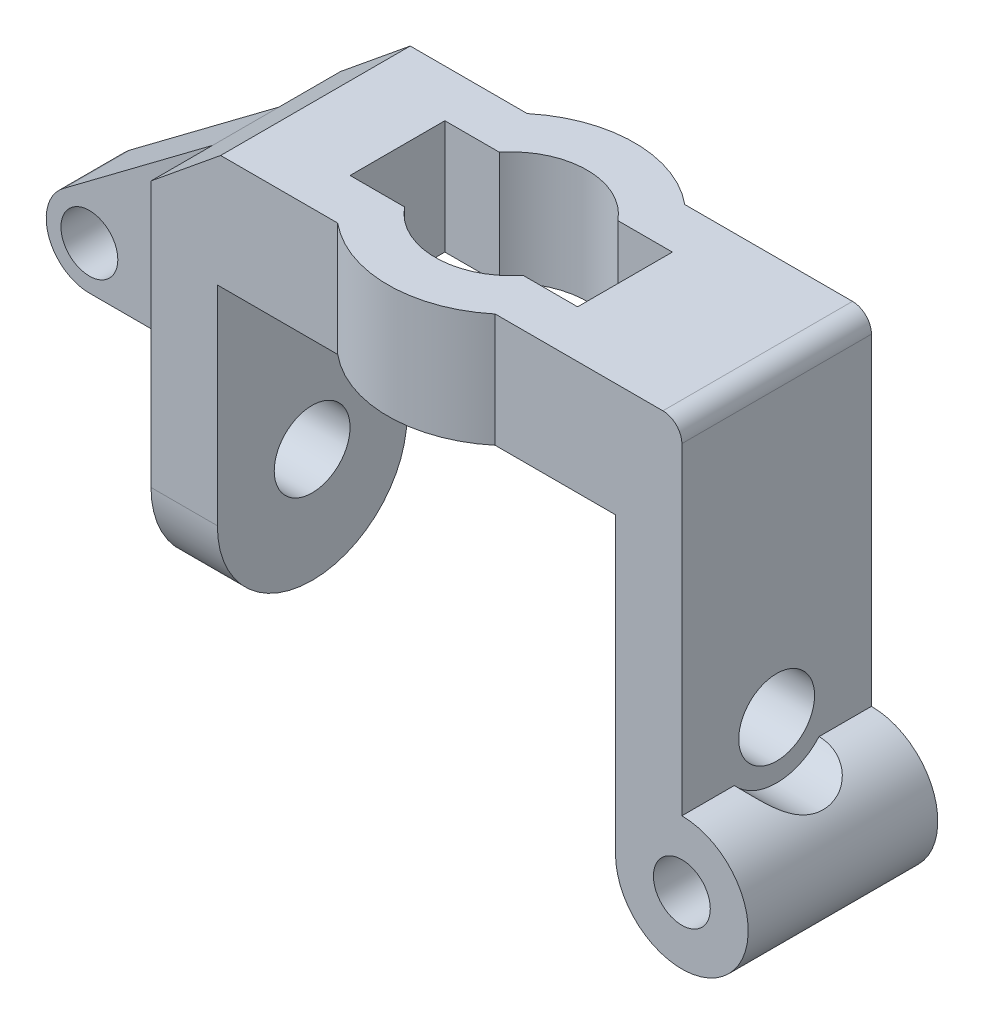
ISO-10303-21;
HEADER;
FILE_DESCRIPTION(('STEP AP214'),'2;1');
FILE_NAME('part.step','',(''),(''),'','','');
FILE_SCHEMA(('AUTOMOTIVE_DESIGN { 1 0 10303 214 1 1 1 1 }'));
ENDSEC;
DATA;
#1=APPLICATION_CONTEXT('core data for automotive mechanical design processes');
#2=APPLICATION_PROTOCOL_DEFINITION('international standard','automotive_design',2000,#1);
#3=PRODUCT_CONTEXT('',#1,'mechanical');
#4=PRODUCT('Part','Part','',(#3));
#5=PRODUCT_RELATED_PRODUCT_CATEGORY('part','',(#4));
#6=PRODUCT_DEFINITION_FORMATION('','',#4);
#7=PRODUCT_DEFINITION_CONTEXT('part definition',#1,'design');
#8=PRODUCT_DEFINITION('design','',#6,#7);
#9=PRODUCT_DEFINITION_SHAPE('','',#8);
#10=(LENGTH_UNIT() NAMED_UNIT(*) SI_UNIT(.MILLI.,.METRE.));
#11=(NAMED_UNIT(*) PLANE_ANGLE_UNIT() SI_UNIT($,.RADIAN.));
#12=(NAMED_UNIT(*) SI_UNIT($,.STERADIAN.) SOLID_ANGLE_UNIT());
#13=UNCERTAINTY_MEASURE_WITH_UNIT(LENGTH_MEASURE(1.E-05),#10,'distance_accuracy_value','');
#14=(GEOMETRIC_REPRESENTATION_CONTEXT(3) GLOBAL_UNCERTAINTY_ASSIGNED_CONTEXT((#13)) GLOBAL_UNIT_ASSIGNED_CONTEXT((#10,
#11,#12)) REPRESENTATION_CONTEXT('',''));
#15=CARTESIAN_POINT('',(0.,0.,0.));
#16=DIRECTION('',(0.,0.,1.));
#17=DIRECTION('',(1.,0.,0.));
#18=AXIS2_PLACEMENT_3D('',#15,#16,#17);
#19=CARTESIAN_POINT('',(28.,0.499999999999997,10.));
#20=DIRECTION('',(0.,0.,-1.));
#21=DIRECTION('',(-1.,0.,0.));
#22=AXIS2_PLACEMENT_3D('',#19,#20,#21);
#23=CYLINDRICAL_SURFACE('',#22,3.5);
#24=CARTESIAN_POINT('',(28.,4.,7.23606797749979));
#25=CARTESIAN_POINT('',(28.0694603582354,4.00001059895191,7.23605558571707));
#26=CARTESIAN_POINT('',(28.1389208504431,3.99793234925885,7.23421800253059));
#27=CARTESIAN_POINT('',(28.2774124358075,3.98967572407927,7.22680329751896));
#28=CARTESIAN_POINT('',(28.3464434284025,3.98349642234035,7.22122533089808));
#29=CARTESIAN_POINT('',(28.4838536248723,3.96708678096784,7.20621451288525));
#30=CARTESIAN_POINT('',(28.5522297181049,3.95684239582203,7.1967682924004));
#31=CARTESIAN_POINT('',(28.6875830116378,3.9324873534187,7.17385981922841));
#32=CARTESIAN_POINT('',(28.7545603023102,3.91837694676905,7.16039782685141));
#33=CARTESIAN_POINT('',(28.9529737469261,3.87050289271094,7.11359499674465));
#34=CARTESIAN_POINT('',(29.0817033689652,3.83121964375717,7.07385642379149));
#35=CARTESIAN_POINT('',(29.3271488358344,3.74125561895766,6.97546757579804));
#36=CARTESIAN_POINT('',(29.4438865911102,3.69059618859735,6.91685263081298));
#37=CARTESIAN_POINT('',(29.6559706263511,3.58562246719081,6.78259490356209));
#38=CARTESIAN_POINT('',(29.7520922612167,3.53161544609046,6.70794447741663));
#39=CARTESIAN_POINT('',(29.9268196044409,3.42368534089598,6.540287332873));
#40=CARTESIAN_POINT('',(30.0054321396643,3.36976223225628,6.44728779563025));
#41=CARTESIAN_POINT('',(30.1363601938254,3.27343049226639,6.25544210120086));
#42=CARTESIAN_POINT('',(30.1905453410244,3.23040815182112,6.15817256087937));
#43=CARTESIAN_POINT('',(30.2832870663822,3.15334737662745,5.95317725286729));
#44=CARTESIAN_POINT('',(30.3218437974595,3.11930885397679,5.84545158749888));
#45=CARTESIAN_POINT('',(30.3828128767488,3.06395330011002,5.62613663266108));
#46=CARTESIAN_POINT('',(30.4056736760428,3.04228616944936,5.51475932542443));
#47=CARTESIAN_POINT('',(30.4375887179098,3.01170328330837,5.28833380285907));
#48=CARTESIAN_POINT('',(30.4466417763198,3.00278862149416,5.17328527354709));
#49=CARTESIAN_POINT('',(30.4512327772078,2.99829375860991,4.94069364656642));
#50=CARTESIAN_POINT('',(30.4465379800806,3.00294318109827,4.82314142789273));
#51=CARTESIAN_POINT('',(30.4229859447946,3.02574817414428,4.59079281696566));
#52=CARTESIAN_POINT('',(30.4041287806935,3.04390367407604,4.47599641030486));
#53=CARTESIAN_POINT('',(30.3516898791931,3.09245581832344,4.252107331064));
#54=CARTESIAN_POINT('',(30.3180625506188,3.12289034050714,4.14303349869407));
#55=CARTESIAN_POINT('',(30.2355824126994,3.19352927796428,3.93423041742039));
#56=CARTESIAN_POINT('',(30.1867342454853,3.2337307136508,3.83449833146729));
#57=CARTESIAN_POINT('',(30.0747680161379,3.31961070113789,3.6487750110606));
#58=CARTESIAN_POINT('',(30.0119151963145,3.36518085069905,3.56257349598757));
#59=CARTESIAN_POINT('',(29.8722612752454,3.45832094281018,3.4036390498356));
#60=CARTESIAN_POINT('',(29.7954606149475,3.50589082210405,3.33090569312031));
#61=CARTESIAN_POINT('',(29.6287663129003,3.59940774084438,3.19895038550356));
#62=CARTESIAN_POINT('',(29.5387543417587,3.64533487922335,3.13986448125606));
#63=CARTESIAN_POINT('',(29.3484721661188,3.73149216102068,3.03570460676564));
#64=CARTESIAN_POINT('',(29.2481963564248,3.77171916263215,2.99063834765253));
#65=CARTESIAN_POINT('',(29.0316117260637,3.84663053067774,2.91043976431284));
#66=CARTESIAN_POINT('',(28.9146620297905,3.88061394293885,2.87639070852977));
#67=CARTESIAN_POINT('',(28.6748659625385,3.9365262763189,2.82201841424072));
#68=CARTESIAN_POINT('',(28.5520202434816,3.95845652682975,2.8016936619693));
#69=CARTESIAN_POINT('',(28.3570005657327,3.98247739403819,2.77970027691788));
#70=CARTESIAN_POINT('',(28.2857986142825,3.98904496461422,2.77376657646234));
#71=CARTESIAN_POINT('',(28.1430713766045,3.9978048634934,2.76589422192441));
#72=CARTESIAN_POINT('',(28.0715472173253,4.00000726425708,2.76394637031206));
#73=CARTESIAN_POINT('',(28.,4.,2.7639320225002));
#74=B_SPLINE_CURVE_WITH_KNOTS('',3,(#24,#25,#26,#27,#28,#29,#30,#31,#32,#33,#34,#35,#36,#37,#38,
#39,#40,#41,#42,#43,#44,#45,#46,#47,#48,#49,#50,#51,#52,#53,#54,#55,#56,#57,#58,#59,#60,#61,#62,
#63,#64,#65,#66,#67,#68,#69,#70,#71,#72,#73),.UNSPECIFIED.,.F.,.F.,(4,2,2,2,2,2,2,2,2,2,2,2,2,2,
2,2,2,2,2,2,2,2,2,2,4),(0.,0.208325126645252,0.416697321053937,0.62579583262883,
0.834880792976182,1.2536151766188,1.67157034500051,2.06872958242957,2.46573369380905,
2.822040709628,3.17834423902776,3.52398903677499,3.86966347563302,4.22122353999218,
4.57278176598822,4.92543286009944,5.27797650592966,5.62433829777031,5.97068914161548,
6.32035645057338,6.6702157459979,7.04806642956408,7.42587543008453,7.64090629382609,
7.85544040182195),.UNSPECIFIED.);
#75=CARTESIAN_POINT('',(28.,4.,7.23606797749979));
#76=VERTEX_POINT('',#75);
#77=CARTESIAN_POINT('',(28.,4.,2.7639320225002));
#78=VERTEX_POINT('',#77);
#79=EDGE_CURVE('E225',#76,#78,#74,.T.);
#80=ORIENTED_EDGE('',*,*,#79,.F.);
#81=DIRECTION('',(0.,0.,-1.));
#82=VECTOR('',#81,1.);
#83=CARTESIAN_POINT('',(28.,4.,10.));
#84=LINE('',#83,#82);
#85=CARTESIAN_POINT('',(28.,4.,10.));
#86=VERTEX_POINT('',#85);
#87=EDGE_CURVE('E234',#86,#76,#84,.T.);
#88=ORIENTED_EDGE('',*,*,#87,.F.);
#89=CARTESIAN_POINT('',(28.,0.499999999999997,10.));
#90=DIRECTION('',(0.,0.,1.));
#91=DIRECTION('',(1.,0.,0.));
#92=AXIS2_PLACEMENT_3D('',#89,#90,#91);
#93=CIRCLE('',#92,3.5);
#94=CARTESIAN_POINT('',(24.5,0.499999999999997,10.));
#95=VERTEX_POINT('',#94);
#96=EDGE_CURVE('E436',#95,#86,#93,.T.);
#97=ORIENTED_EDGE('',*,*,#96,.F.);
#98=DIRECTION('',(0.,0.,-1.));
#99=VECTOR('',#98,1.);
#100=CARTESIAN_POINT('',(24.5,0.499999999999997,10.));
#101=LINE('',#100,#99);
#102=CARTESIAN_POINT('',(24.5,0.499999999999997,0.));
#103=VERTEX_POINT('',#102);
#104=EDGE_CURVE('E244',#95,#103,#101,.T.);
#105=ORIENTED_EDGE('',*,*,#104,.T.);
#106=CARTESIAN_POINT('',(28.,0.499999999999997,0.));
#107=DIRECTION('',(0.,0.,1.));
#108=DIRECTION('',(1.,0.,0.));
#109=AXIS2_PLACEMENT_3D('',#106,#107,#108);
#110=CIRCLE('',#109,3.5);
#111=CARTESIAN_POINT('',(28.,4.,0.));
#112=VERTEX_POINT('',#111);
#113=EDGE_CURVE('E450',#103,#112,#110,.T.);
#114=ORIENTED_EDGE('',*,*,#113,.T.);
#115=EDGE_CURVE('E236',#78,#112,#84,.T.);
#116=ORIENTED_EDGE('',*,*,#115,.F.);
#117=EDGE_LOOP('',(#80,#88,#97,#105,#114,#116));
#118=FACE_BOUND('',#117,.T.);
#119=ADVANCED_FACE('F40',(#118),#23,.T.);
#120=CARTESIAN_POINT('',(0.,0.,10.));
#121=DIRECTION('',(-1.,0.,0.));
#122=DIRECTION('',(0.,0.,1.));
#123=AXIS2_PLACEMENT_3D('',#120,#121,#122);
#124=PLANE('',#123);
#125=CARTESIAN_POINT('',(0.,6.,5.));
#126=DIRECTION('',(1.,0.,0.));
#127=DIRECTION('',(0.,0.,-1.));
#128=AXIS2_PLACEMENT_3D('',#125,#126,#127);
#129=CIRCLE('',#128,2.);
#130=CARTESIAN_POINT('',(0.,6.,3.));
#131=VERTEX_POINT('',#130);
#132=EDGE_CURVE('E237',#131,#131,#129,.T.);
#133=ORIENTED_EDGE('',*,*,#132,.T.);
#134=EDGE_LOOP('',(#133));
#135=FACE_BOUND('',#134,.T.);
#136=DIRECTION('',(0.,1.,0.));
#137=VECTOR('',#136,1.);
#138=CARTESIAN_POINT('',(0.,0.,0.));
#139=LINE('',#138,#137);
#140=CARTESIAN_POINT('',(0.,5.,0.));
#141=VERTEX_POINT('',#140);
#142=CARTESIAN_POINT('',(0.,19.,0.));
#143=VERTEX_POINT('',#142);
#144=EDGE_CURVE('E251',#141,#143,#139,.T.);
#145=ORIENTED_EDGE('',*,*,#144,.F.);
#146=CARTESIAN_POINT('',(0.,5.,5.));
#147=DIRECTION('',(-1.,0.,0.));
#148=DIRECTION('',(0.,0.,1.));
#149=AXIS2_PLACEMENT_3D('',#146,#147,#148);
#150=CIRCLE('',#149,5.);
#151=CARTESIAN_POINT('',(0.,0.,5.));
#152=VERTEX_POINT('',#151);
#153=EDGE_CURVE('E49',#141,#152,#150,.T.);
#154=ORIENTED_EDGE('',*,*,#153,.T.);
#155=CARTESIAN_POINT('',(0.,5.,5.));
#156=DIRECTION('',(-1.,0.,0.));
#157=DIRECTION('',(0.,0.,1.));
#158=AXIS2_PLACEMENT_3D('',#155,#156,#157);
#159=CIRCLE('',#158,5.);
#160=CARTESIAN_POINT('',(0.,5.,10.));
#161=VERTEX_POINT('',#160);
#162=EDGE_CURVE('E60',#152,#161,#159,.T.);
#163=ORIENTED_EDGE('',*,*,#162,.T.);
#164=DIRECTION('',(0.,1.,0.));
#165=VECTOR('',#164,1.);
#166=CARTESIAN_POINT('',(0.,0.,10.));
#167=LINE('',#166,#165);
#168=CARTESIAN_POINT('',(0.,19.,10.));
#169=VERTEX_POINT('',#168);
#170=EDGE_CURVE('E249',#161,#169,#167,.T.);
#171=ORIENTED_EDGE('',*,*,#170,.T.);
#172=DIRECTION('',(0.,0.,1.));
#173=VECTOR('',#172,1.);
#174=CARTESIAN_POINT('',(0.,19.,-1.5));
#175=LINE('',#174,#173);
#176=CARTESIAN_POINT('',(0.,19.,6.75));
#177=VERTEX_POINT('',#176);
#178=EDGE_CURVE('E310',#177,#169,#175,.T.);
#179=ORIENTED_EDGE('',*,*,#178,.F.);
#180=DIRECTION('',(0.,-1.,0.));
#181=VECTOR('',#180,1.);
#182=CARTESIAN_POINT('',(0.,0.,6.75));
#183=LINE('',#182,#181);
#184=CARTESIAN_POINT('',(0.,9.,6.75));
#185=VERTEX_POINT('',#184);
#186=EDGE_CURVE('E331',#177,#185,#183,.T.);
#187=ORIENTED_EDGE('',*,*,#186,.T.);
#188=DIRECTION('',(0.,0.,1.));
#189=VECTOR('',#188,1.);
#190=CARTESIAN_POINT('',(0.,9.,3.25));
#191=LINE('',#190,#189);
#192=CARTESIAN_POINT('',(0.,9.,3.25));
#193=VERTEX_POINT('',#192);
#194=EDGE_CURVE('E348',#193,#185,#191,.T.);
#195=ORIENTED_EDGE('',*,*,#194,.F.);
#196=DIRECTION('',(0.,-1.,0.));
#197=VECTOR('',#196,1.);
#198=CARTESIAN_POINT('',(0.,0.,3.25));
#199=LINE('',#198,#197);
#200=CARTESIAN_POINT('',(0.,19.,3.25));
#201=VERTEX_POINT('',#200);
#202=EDGE_CURVE('E342',#201,#193,#199,.T.);
#203=ORIENTED_EDGE('',*,*,#202,.F.);
#204=EDGE_CURVE('E313',#143,#201,#175,.T.);
#205=ORIENTED_EDGE('',*,*,#204,.F.);
#206=EDGE_LOOP('',(#145,#154,#163,#171,#179,#187,#195,#203,#205));
#207=FACE_BOUND('',#206,.T.);
#208=ADVANCED_FACE('F508',(#135,#207),#124,.T.);
#209=CARTESIAN_POINT('',(0.,22.,10.));
#210=DIRECTION('',(0.,1.,0.));
#211=DIRECTION('',(0.,0.,1.));
#212=AXIS2_PLACEMENT_3D('',#209,#210,#211);
#213=PLANE('',#212);
#214=DIRECTION('',(1.,0.,0.));
#215=VECTOR('',#214,1.);
#216=CARTESIAN_POINT('',(0.,22.,7.5));
#217=LINE('',#216,#215);
#218=CARTESIAN_POINT('',(8.,22.,7.5));
#219=VERTEX_POINT('',#218);
#220=CARTESIAN_POINT('',(10.8775010008008,22.,7.5));
#221=VERTEX_POINT('',#220);
#222=EDGE_CURVE('E268',#219,#221,#217,.T.);
#223=ORIENTED_EDGE('',*,*,#222,.F.);
#224=DIRECTION('',(0.,0.,1.));
#225=VECTOR('',#224,1.);
#226=CARTESIAN_POINT('',(8.,22.,0.));
#227=LINE('',#226,#225);
#228=CARTESIAN_POINT('',(8.,22.,2.5));
#229=VERTEX_POINT('',#228);
#230=EDGE_CURVE('E360',#229,#219,#227,.T.);
#231=ORIENTED_EDGE('',*,*,#230,.F.);
#232=DIRECTION('',(1.,0.,0.));
#233=VECTOR('',#232,1.);
#234=CARTESIAN_POINT('',(0.,22.,2.5));
#235=LINE('',#234,#233);
#236=CARTESIAN_POINT('',(10.8775010008008,22.,2.5));
#237=VERTEX_POINT('',#236);
#238=EDGE_CURVE('E395',#229,#237,#235,.T.);
#239=ORIENTED_EDGE('',*,*,#238,.T.);
#240=CARTESIAN_POINT('',(14.,22.,5.));
#241=DIRECTION('',(0.,1.,0.));
#242=DIRECTION('',(0.,0.,1.));
#243=AXIS2_PLACEMENT_3D('',#240,#241,#242);
#244=CIRCLE('',#243,4.);
#245=CARTESIAN_POINT('',(17.1224989991992,22.,2.5));
#246=VERTEX_POINT('',#245);
#247=EDGE_CURVE('E392',#246,#237,#244,.T.);
#248=ORIENTED_EDGE('',*,*,#247,.F.);
#249=DIRECTION('',(1.,0.,0.));
#250=VECTOR('',#249,1.);
#251=CARTESIAN_POINT('',(0.,22.,2.5));
#252=LINE('',#251,#250);
#253=CARTESIAN_POINT('',(20.,22.,2.5));
#254=VERTEX_POINT('',#253);
#255=EDGE_CURVE('E389',#246,#254,#252,.T.);
#256=ORIENTED_EDGE('',*,*,#255,.T.);
#257=DIRECTION('',(0.,0.,1.));
#258=VECTOR('',#257,1.);
#259=CARTESIAN_POINT('',(20.,22.,0.));
#260=LINE('',#259,#258);
#261=CARTESIAN_POINT('',(20.,22.,7.5));
#262=VERTEX_POINT('',#261);
#263=EDGE_CURVE('E386',#254,#262,#260,.T.);
#264=ORIENTED_EDGE('',*,*,#263,.T.);
#265=DIRECTION('',(1.,0.,0.));
#266=VECTOR('',#265,1.);
#267=CARTESIAN_POINT('',(0.,22.,7.5));
#268=LINE('',#267,#266);
#269=CARTESIAN_POINT('',(17.1224989991992,22.,7.5));
#270=VERTEX_POINT('',#269);
#271=EDGE_CURVE('E383',#270,#262,#268,.T.);
#272=ORIENTED_EDGE('',*,*,#271,.F.);
#273=CARTESIAN_POINT('',(14.,22.,5.));
#274=DIRECTION('',(0.,1.,0.));
#275=DIRECTION('',(0.,0.,1.));
#276=AXIS2_PLACEMENT_3D('',#273,#274,#275);
#277=CIRCLE('',#276,4.);
#278=EDGE_CURVE('E380',#221,#270,#277,.T.);
#279=ORIENTED_EDGE('',*,*,#278,.F.);
#280=EDGE_LOOP('',(#223,#231,#239,#248,#256,#264,#272,#279));
#281=FACE_BOUND('',#280,.T.);
#282=DIRECTION('',(1.,0.,0.));
#283=VECTOR('',#282,1.);
#284=CARTESIAN_POINT('',(0.,22.,10.));
#285=LINE('',#284,#283);
#286=CARTESIAN_POINT('',(18.153311931459,22.,10.));
#287=VERTEX_POINT('',#286);
#288=CARTESIAN_POINT('',(27.,22.,10.));
#289=VERTEX_POINT('',#288);
#290=EDGE_CURVE('E439',#287,#289,#285,.T.);
#291=ORIENTED_EDGE('',*,*,#290,.T.);
#292=DIRECTION('',(0.,0.,-1.));
#293=VECTOR('',#292,1.);
#294=CARTESIAN_POINT('',(27.,22.,10.));
#295=LINE('',#294,#293);
#296=CARTESIAN_POINT('',(27.,22.,0.));
#297=VERTEX_POINT('',#296);
#298=EDGE_CURVE('E264',#289,#297,#295,.T.);
#299=ORIENTED_EDGE('',*,*,#298,.T.);
#300=DIRECTION('',(1.,0.,0.));
#301=VECTOR('',#300,1.);
#302=CARTESIAN_POINT('',(0.,22.,0.));
#303=LINE('',#302,#301);
#304=CARTESIAN_POINT('',(18.153311931459,22.,0.));
#305=VERTEX_POINT('',#304);
#306=EDGE_CURVE('E454',#305,#297,#303,.T.);
#307=ORIENTED_EDGE('',*,*,#306,.F.);
#308=CARTESIAN_POINT('',(14.,22.,5.));
#309=DIRECTION('',(0.,1.,0.));
#310=DIRECTION('',(0.,0.,1.));
#311=AXIS2_PLACEMENT_3D('',#308,#309,#310);
#312=CIRCLE('',#311,6.5);
#313=CARTESIAN_POINT('',(9.84668806854096,22.,0.));
#314=VERTEX_POINT('',#313);
#315=EDGE_CURVE('E420',#305,#314,#312,.T.);
#316=ORIENTED_EDGE('',*,*,#315,.T.);
#317=CARTESIAN_POINT('',(3.67295557835446,22.,0.));
#318=VERTEX_POINT('',#317);
#319=EDGE_CURVE('E455',#318,#314,#303,.T.);
#320=ORIENTED_EDGE('',*,*,#319,.F.);
#321=DIRECTION('',(0.,0.,1.));
#322=VECTOR('',#321,1.);
#323=CARTESIAN_POINT('',(3.67295557835446,22.,-1.5));
#324=LINE('',#323,#322);
#325=CARTESIAN_POINT('',(3.67295557835446,22.,10.));
#326=VERTEX_POINT('',#325);
#327=EDGE_CURVE('E289',#318,#326,#324,.T.);
#328=ORIENTED_EDGE('',*,*,#327,.T.);
#329=CARTESIAN_POINT('',(9.84668806854096,22.,10.));
#330=VERTEX_POINT('',#329);
#331=EDGE_CURVE('E440',#326,#330,#285,.T.);
#332=ORIENTED_EDGE('',*,*,#331,.T.);
#333=EDGE_CURVE('E402',#330,#287,#312,.T.);
#334=ORIENTED_EDGE('',*,*,#333,.T.);
#335=EDGE_LOOP('',(#291,#299,#307,#316,#320,#328,#332,#334));
#336=FACE_BOUND('',#335,.T.);
#337=ADVANCED_FACE('F469',(#281,#336),#213,.T.);
#338=CARTESIAN_POINT('',(0.,0.,10.));
#339=DIRECTION('',(0.,0.,1.));
#340=DIRECTION('',(1.,0.,0.));
#341=AXIS2_PLACEMENT_3D('',#338,#339,#340);
#342=PLANE('',#341);
#343=ORIENTED_EDGE('',*,*,#170,.F.);
#344=DIRECTION('',(1.,0.,0.));
#345=VECTOR('',#344,1.);
#346=CARTESIAN_POINT('',(3.5,5.,10.));
#347=LINE('',#346,#345);
#348=CARTESIAN_POINT('',(3.5,5.,10.));
#349=VERTEX_POINT('',#348);
#350=EDGE_CURVE('E11',#161,#349,#347,.T.);
#351=ORIENTED_EDGE('',*,*,#350,.T.);
#352=DIRECTION('',(0.,1.,0.));
#353=VECTOR('',#352,1.);
#354=CARTESIAN_POINT('',(3.5,0.,10.));
#355=LINE('',#354,#353);
#356=CARTESIAN_POINT('',(3.5,16.,10.));
#357=VERTEX_POINT('',#356);
#358=EDGE_CURVE('E428',#349,#357,#355,.T.);
#359=ORIENTED_EDGE('',*,*,#358,.T.);
#360=DIRECTION('',(1.,0.,0.));
#361=VECTOR('',#360,1.);
#362=CARTESIAN_POINT('',(0.,16.,10.));
#363=LINE('',#362,#361);
#364=CARTESIAN_POINT('',(9.84668806854096,16.,10.));
#365=VERTEX_POINT('',#364);
#366=EDGE_CURVE('E431',#357,#365,#363,.T.);
#367=ORIENTED_EDGE('',*,*,#366,.T.);
#368=DIRECTION('',(0.,1.,0.));
#369=VECTOR('',#368,1.);
#370=CARTESIAN_POINT('',(9.84668806854096,16.,10.));
#371=LINE('',#370,#369);
#372=EDGE_CURVE('E422',#330,#365,#371,.F.);
#373=ORIENTED_EDGE('',*,*,#372,.F.);
#374=ORIENTED_EDGE('',*,*,#331,.F.);
#375=DIRECTION('',(-0.774488777671264,-0.632587648679036,0.));
#376=VECTOR('',#375,1.);
#377=CARTESIAN_POINT('',(-9.30870866111195,11.3968244680358,10.));
#378=LINE('',#377,#376);
#379=EDGE_CURVE('E319',#326,#169,#378,.T.);
#380=ORIENTED_EDGE('',*,*,#379,.T.);
#381=EDGE_LOOP('',(#343,#351,#359,#367,#373,#374,#380));
#382=FACE_BOUND('',#381,.T.);
#383=ADVANCED_FACE('F518',(#382),#342,.T.);
#384=CARTESIAN_POINT('',(0.,0.,0.));
#385=DIRECTION('',(0.,0.,1.));
#386=DIRECTION('',(1.,0.,0.));
#387=AXIS2_PLACEMENT_3D('',#384,#385,#386);
#388=PLANE('',#387);
#389=DIRECTION('',(0.,1.,0.));
#390=VECTOR('',#389,1.);
#391=CARTESIAN_POINT('',(3.5,0.,0.));
#392=LINE('',#391,#390);
#393=CARTESIAN_POINT('',(3.5,5.,0.));
#394=VERTEX_POINT('',#393);
#395=CARTESIAN_POINT('',(3.5,16.,0.));
#396=VERTEX_POINT('',#395);
#397=EDGE_CURVE('E427',#394,#396,#392,.T.);
#398=ORIENTED_EDGE('',*,*,#397,.F.);
#399=DIRECTION('',(1.,0.,0.));
#400=VECTOR('',#399,1.);
#401=CARTESIAN_POINT('',(0.,5.,0.));
#402=LINE('',#401,#400);
#403=EDGE_CURVE('E282',#394,#141,#402,.F.);
#404=ORIENTED_EDGE('',*,*,#403,.T.);
#405=ORIENTED_EDGE('',*,*,#144,.T.);
#406=DIRECTION('',(-0.774488777671264,-0.632587648679036,0.));
#407=VECTOR('',#406,1.);
#408=CARTESIAN_POINT('',(-9.30870866111195,11.3968244680358,0.));
#409=LINE('',#408,#407);
#410=EDGE_CURVE('E316',#318,#143,#409,.T.);
#411=ORIENTED_EDGE('',*,*,#410,.F.);
#412=ORIENTED_EDGE('',*,*,#319,.T.);
#413=DIRECTION('',(0.,1.,0.));
#414=VECTOR('',#413,1.);
#415=CARTESIAN_POINT('',(9.84668806854096,16.,0.));
#416=LINE('',#415,#414);
#417=CARTESIAN_POINT('',(9.84668806854096,16.,0.));
#418=VERTEX_POINT('',#417);
#419=EDGE_CURVE('E259',#314,#418,#416,.F.);
#420=ORIENTED_EDGE('',*,*,#419,.T.);
#421=DIRECTION('',(1.,0.,0.));
#422=VECTOR('',#421,1.);
#423=CARTESIAN_POINT('',(0.,16.,0.));
#424=LINE('',#423,#422);
#425=EDGE_CURVE('E445',#396,#418,#424,.T.);
#426=ORIENTED_EDGE('',*,*,#425,.F.);
#427=EDGE_LOOP('',(#398,#404,#405,#411,#412,#420,#426));
#428=FACE_BOUND('',#427,.T.);
#429=ADVANCED_FACE('F495',(#428),#388,.F.);
#430=CARTESIAN_POINT('',(28.,0.499999999999997,10.));
#431=DIRECTION('',(0.,0.,1.));
#432=DIRECTION('',(1.,0.,0.));
#433=AXIS2_PLACEMENT_3D('',#430,#431,#432);
#434=CIRCLE('',#433,1.5);
#435=CARTESIAN_POINT('',(29.5,0.499999999999997,10.));
#436=VERTEX_POINT('',#435);
#437=EDGE_CURVE('E269',#436,#436,#434,.T.);
#438=ORIENTED_EDGE('',*,*,#437,.F.);
#439=EDGE_LOOP('',(#438));
#440=FACE_BOUND('',#439,.T.);
#441=DIRECTION('',(0.,-1.,0.));
#442=VECTOR('',#441,1.);
#443=CARTESIAN_POINT('',(28.,0.,10.));
#444=LINE('',#443,#442);
#445=CARTESIAN_POINT('',(28.,21.,10.));
#446=VERTEX_POINT('',#445);
#447=EDGE_CURVE('E242',#446,#86,#444,.T.);
#448=ORIENTED_EDGE('',*,*,#447,.F.);
#449=CARTESIAN_POINT('',(27.,21.,10.));
#450=DIRECTION('',(0.,0.,1.));
#451=DIRECTION('',(1.,0.,0.));
#452=AXIS2_PLACEMENT_3D('',#449,#450,#451);
#453=CIRCLE('',#452,1.);
#454=EDGE_CURVE('E276',#446,#289,#453,.T.);
#455=ORIENTED_EDGE('',*,*,#454,.T.);
#456=ORIENTED_EDGE('',*,*,#290,.F.);
#457=DIRECTION('',(0.,1.,0.));
#458=VECTOR('',#457,1.);
#459=CARTESIAN_POINT('',(18.153311931459,16.,10.));
#460=LINE('',#459,#458);
#461=CARTESIAN_POINT('',(18.153311931459,16.,10.));
#462=VERTEX_POINT('',#461);
#463=EDGE_CURVE('E424',#462,#287,#460,.T.);
#464=ORIENTED_EDGE('',*,*,#463,.F.);
#465=CARTESIAN_POINT('',(24.5,16.,10.));
#466=VERTEX_POINT('',#465);
#467=EDGE_CURVE('E430',#462,#466,#363,.T.);
#468=ORIENTED_EDGE('',*,*,#467,.T.);
#469=DIRECTION('',(0.,-1.,0.));
#470=VECTOR('',#469,1.);
#471=CARTESIAN_POINT('',(24.5,0.,10.));
#472=LINE('',#471,#470);
#473=EDGE_CURVE('E434',#466,#95,#472,.T.);
#474=ORIENTED_EDGE('',*,*,#473,.T.);
#475=ORIENTED_EDGE('',*,*,#96,.T.);
#476=EDGE_LOOP('',(#448,#455,#456,#464,#468,#474,#475));
#477=FACE_BOUND('',#476,.T.);
#478=ADVANCED_FACE('F477',(#440,#477),#342,.T.);
#479=CARTESIAN_POINT('',(28.,0.499999999999997,0.));
#480=DIRECTION('',(0.,0.,1.));
#481=DIRECTION('',(1.,0.,0.));
#482=AXIS2_PLACEMENT_3D('',#479,#480,#481);
#483=CIRCLE('',#482,1.5);
#484=CARTESIAN_POINT('',(29.5,0.499999999999997,0.));
#485=VERTEX_POINT('',#484);
#486=EDGE_CURVE('E265',#485,#485,#483,.T.);
#487=ORIENTED_EDGE('',*,*,#486,.T.);
#488=EDGE_LOOP('',(#487));
#489=FACE_BOUND('',#488,.T.);
#490=ORIENTED_EDGE('',*,*,#306,.T.);
#491=CARTESIAN_POINT('',(27.,21.,0.));
#492=DIRECTION('',(0.,0.,1.));
#493=DIRECTION('',(1.,0.,0.));
#494=AXIS2_PLACEMENT_3D('',#491,#492,#493);
#495=CIRCLE('',#494,1.);
#496=CARTESIAN_POINT('',(28.,21.,0.));
#497=VERTEX_POINT('',#496);
#498=EDGE_CURVE('E272',#297,#497,#495,.F.);
#499=ORIENTED_EDGE('',*,*,#498,.T.);
#500=DIRECTION('',(0.,-1.,0.));
#501=VECTOR('',#500,1.);
#502=CARTESIAN_POINT('',(28.,0.,0.));
#503=LINE('',#502,#501);
#504=EDGE_CURVE('E452',#497,#112,#503,.T.);
#505=ORIENTED_EDGE('',*,*,#504,.T.);
#506=ORIENTED_EDGE('',*,*,#113,.F.);
#507=DIRECTION('',(0.,-1.,0.));
#508=VECTOR('',#507,1.);
#509=CARTESIAN_POINT('',(24.5,0.,0.));
#510=LINE('',#509,#508);
#511=CARTESIAN_POINT('',(24.5,16.,0.));
#512=VERTEX_POINT('',#511);
#513=EDGE_CURVE('E448',#512,#103,#510,.T.);
#514=ORIENTED_EDGE('',*,*,#513,.F.);
#515=CARTESIAN_POINT('',(18.153311931459,16.,0.));
#516=VERTEX_POINT('',#515);
#517=EDGE_CURVE('E444',#516,#512,#424,.T.);
#518=ORIENTED_EDGE('',*,*,#517,.F.);
#519=DIRECTION('',(0.,1.,0.));
#520=VECTOR('',#519,1.);
#521=CARTESIAN_POINT('',(18.153311931459,16.,0.));
#522=LINE('',#521,#520);
#523=EDGE_CURVE('E261',#516,#305,#522,.T.);
#524=ORIENTED_EDGE('',*,*,#523,.T.);
#525=EDGE_LOOP('',(#490,#499,#505,#506,#514,#518,#524));
#526=FACE_BOUND('',#525,.T.);
#527=ADVANCED_FACE('F462',(#489,#526),#388,.F.);
#528=CARTESIAN_POINT('',(3.5,0.,10.));
#529=DIRECTION('',(-1.,0.,0.));
#530=DIRECTION('',(0.,0.,1.));
#531=AXIS2_PLACEMENT_3D('',#528,#529,#530);
#532=PLANE('',#531);
#533=CARTESIAN_POINT('',(3.5,6.,5.));
#534=DIRECTION('',(-1.,0.,0.));
#535=DIRECTION('',(0.,0.,1.));
#536=AXIS2_PLACEMENT_3D('',#533,#534,#535);
#537=CIRCLE('',#536,2.);
#538=CARTESIAN_POINT('',(3.5,6.,7.));
#539=VERTEX_POINT('',#538);
#540=EDGE_CURVE('E290',#539,#539,#537,.F.);
#541=ORIENTED_EDGE('',*,*,#540,.F.);
#542=EDGE_LOOP('',(#541));
#543=FACE_BOUND('',#542,.T.);
#544=CARTESIAN_POINT('',(3.5,5.,5.));
#545=DIRECTION('',(-1.,0.,0.));
#546=DIRECTION('',(0.,0.,1.));
#547=AXIS2_PLACEMENT_3D('',#544,#545,#546);
#548=CIRCLE('',#547,5.);
#549=CARTESIAN_POINT('',(3.5,0.,5.));
#550=VERTEX_POINT('',#549);
#551=EDGE_CURVE('E278',#349,#550,#548,.F.);
#552=ORIENTED_EDGE('',*,*,#551,.T.);
#553=CARTESIAN_POINT('',(3.5,5.,5.));
#554=DIRECTION('',(-1.,0.,0.));
#555=DIRECTION('',(0.,0.,1.));
#556=AXIS2_PLACEMENT_3D('',#553,#554,#555);
#557=CIRCLE('',#556,5.);
#558=EDGE_CURVE('E280',#550,#394,#557,.F.);
#559=ORIENTED_EDGE('',*,*,#558,.T.);
#560=ORIENTED_EDGE('',*,*,#397,.T.);
#561=DIRECTION('',(0.,0.,-1.));
#562=VECTOR('',#561,1.);
#563=CARTESIAN_POINT('',(3.5,16.,10.));
#564=LINE('',#563,#562);
#565=EDGE_CURVE('E256',#357,#396,#564,.T.);
#566=ORIENTED_EDGE('',*,*,#565,.F.);
#567=ORIENTED_EDGE('',*,*,#358,.F.);
#568=EDGE_LOOP('',(#552,#559,#560,#566,#567));
#569=FACE_BOUND('',#568,.T.);
#570=ADVANCED_FACE('F501',(#543,#569),#532,.F.);
#571=CARTESIAN_POINT('',(0.,16.,10.));
#572=DIRECTION('',(0.,1.,0.));
#573=DIRECTION('',(0.,0.,1.));
#574=AXIS2_PLACEMENT_3D('',#571,#572,#573);
#575=PLANE('',#574);
#576=DIRECTION('',(0.,0.,1.));
#577=VECTOR('',#576,1.);
#578=CARTESIAN_POINT('',(8.,16.,0.));
#579=LINE('',#578,#577);
#580=CARTESIAN_POINT('',(8.,16.,2.5));
#581=VERTEX_POINT('',#580);
#582=CARTESIAN_POINT('',(8.,16.,7.5));
#583=VERTEX_POINT('',#582);
#584=EDGE_CURVE('E375',#581,#583,#579,.T.);
#585=ORIENTED_EDGE('',*,*,#584,.T.);
#586=DIRECTION('',(1.,0.,0.));
#587=VECTOR('',#586,1.);
#588=CARTESIAN_POINT('',(0.,16.,7.5));
#589=LINE('',#588,#587);
#590=CARTESIAN_POINT('',(10.8775010008008,16.,7.5));
#591=VERTEX_POINT('',#590);
#592=EDGE_CURVE('E356',#583,#591,#589,.T.);
#593=ORIENTED_EDGE('',*,*,#592,.T.);
#594=CARTESIAN_POINT('',(14.,16.,5.));
#595=DIRECTION('',(0.,1.,0.));
#596=DIRECTION('',(0.,0.,1.));
#597=AXIS2_PLACEMENT_3D('',#594,#595,#596);
#598=CIRCLE('',#597,4.);
#599=CARTESIAN_POINT('',(17.1224989991992,16.,7.5));
#600=VERTEX_POINT('',#599);
#601=EDGE_CURVE('E359',#591,#600,#598,.T.);
#602=ORIENTED_EDGE('',*,*,#601,.T.);
#603=DIRECTION('',(1.,0.,0.));
#604=VECTOR('',#603,1.);
#605=CARTESIAN_POINT('',(0.,16.,7.5));
#606=LINE('',#605,#604);
#607=CARTESIAN_POINT('',(20.,16.,7.5));
#608=VERTEX_POINT('',#607);
#609=EDGE_CURVE('E363',#600,#608,#606,.T.);
#610=ORIENTED_EDGE('',*,*,#609,.T.);
#611=DIRECTION('',(0.,0.,1.));
#612=VECTOR('',#611,1.);
#613=CARTESIAN_POINT('',(20.,16.,0.));
#614=LINE('',#613,#612);
#615=CARTESIAN_POINT('',(20.,16.,2.5));
#616=VERTEX_POINT('',#615);
#617=EDGE_CURVE('E366',#616,#608,#614,.T.);
#618=ORIENTED_EDGE('',*,*,#617,.F.);
#619=DIRECTION('',(1.,0.,0.));
#620=VECTOR('',#619,1.);
#621=CARTESIAN_POINT('',(0.,16.,2.5));
#622=LINE('',#621,#620);
#623=CARTESIAN_POINT('',(17.1224989991992,16.,2.5));
#624=VERTEX_POINT('',#623);
#625=EDGE_CURVE('E368',#624,#616,#622,.T.);
#626=ORIENTED_EDGE('',*,*,#625,.F.);
#627=CARTESIAN_POINT('',(14.,16.,5.));
#628=DIRECTION('',(0.,1.,0.));
#629=DIRECTION('',(0.,0.,1.));
#630=AXIS2_PLACEMENT_3D('',#627,#628,#629);
#631=CIRCLE('',#630,4.);
#632=CARTESIAN_POINT('',(10.8775010008008,16.,2.5));
#633=VERTEX_POINT('',#632);
#634=EDGE_CURVE('E370',#624,#633,#631,.T.);
#635=ORIENTED_EDGE('',*,*,#634,.T.);
#636=DIRECTION('',(1.,0.,0.));
#637=VECTOR('',#636,1.);
#638=CARTESIAN_POINT('',(0.,16.,2.5));
#639=LINE('',#638,#637);
#640=EDGE_CURVE('E373',#581,#633,#639,.T.);
#641=ORIENTED_EDGE('',*,*,#640,.F.);
#642=EDGE_LOOP('',(#585,#593,#602,#610,#618,#626,#635,#641));
#643=FACE_BOUND('',#642,.T.);
#644=ORIENTED_EDGE('',*,*,#425,.T.);
#645=CARTESIAN_POINT('',(14.,16.,5.));
#646=DIRECTION('',(0.,1.,0.));
#647=DIRECTION('',(0.,0.,1.));
#648=AXIS2_PLACEMENT_3D('',#645,#646,#647);
#649=CIRCLE('',#648,6.5);
#650=EDGE_CURVE('E419',#516,#418,#649,.T.);
#651=ORIENTED_EDGE('',*,*,#650,.F.);
#652=ORIENTED_EDGE('',*,*,#517,.T.);
#653=DIRECTION('',(0.,0.,-1.));
#654=VECTOR('',#653,1.);
#655=CARTESIAN_POINT('',(24.5,16.,10.));
#656=LINE('',#655,#654);
#657=EDGE_CURVE('E247',#466,#512,#656,.T.);
#658=ORIENTED_EDGE('',*,*,#657,.F.);
#659=ORIENTED_EDGE('',*,*,#467,.F.);
#660=EDGE_CURVE('E417',#365,#462,#649,.T.);
#661=ORIENTED_EDGE('',*,*,#660,.F.);
#662=ORIENTED_EDGE('',*,*,#366,.F.);
#663=ORIENTED_EDGE('',*,*,#565,.T.);
#664=EDGE_LOOP('',(#644,#651,#652,#658,#659,#661,#662,#663));
#665=FACE_BOUND('',#664,.T.);
#666=ADVANCED_FACE('F487',(#643,#665),#575,.F.);
#667=CARTESIAN_POINT('',(24.5,0.,10.));
#668=DIRECTION('',(1.,0.,0.));
#669=DIRECTION('',(0.,1.,0.));
#670=AXIS2_PLACEMENT_3D('',#667,#668,#669);
#671=PLANE('',#670);
#672=CARTESIAN_POINT('',(24.5,6.,5.));
#673=DIRECTION('',(1.,0.,0.));
#674=DIRECTION('',(0.,1.,0.));
#675=AXIS2_PLACEMENT_3D('',#672,#673,#674);
#676=CIRCLE('',#675,2.);
#677=CARTESIAN_POINT('',(24.5,8.,5.));
#678=VERTEX_POINT('',#677);
#679=EDGE_CURVE('E293',#678,#678,#676,.F.);
#680=ORIENTED_EDGE('',*,*,#679,.F.);
#681=EDGE_LOOP('',(#680));
#682=FACE_BOUND('',#681,.T.);
#683=ORIENTED_EDGE('',*,*,#513,.T.);
#684=ORIENTED_EDGE('',*,*,#104,.F.);
#685=ORIENTED_EDGE('',*,*,#473,.F.);
#686=ORIENTED_EDGE('',*,*,#657,.T.);
#687=EDGE_LOOP('',(#683,#684,#685,#686));
#688=FACE_BOUND('',#687,.T.);
#689=ADVANCED_FACE('F483',(#682,#688),#671,.F.);
#690=CARTESIAN_POINT('',(28.,0.,10.));
#691=DIRECTION('',(1.,0.,0.));
#692=DIRECTION('',(0.,0.,-1.));
#693=AXIS2_PLACEMENT_3D('',#690,#691,#692);
#694=PLANE('',#693);
#695=CARTESIAN_POINT('',(28.,6.,5.));
#696=DIRECTION('',(1.,0.,0.));
#697=DIRECTION('',(0.,0.,-1.));
#698=AXIS2_PLACEMENT_3D('',#695,#696,#697);
#699=CIRCLE('',#698,3.);
#700=EDGE_CURVE('E222',#76,#78,#699,.T.);
#701=ORIENTED_EDGE('',*,*,#700,.T.);
#702=ORIENTED_EDGE('',*,*,#115,.T.);
#703=ORIENTED_EDGE('',*,*,#504,.F.);
#704=DIRECTION('',(0.,0.,-1.));
#705=VECTOR('',#704,1.);
#706=CARTESIAN_POINT('',(28.,21.,10.));
#707=LINE('',#706,#705);
#708=EDGE_CURVE('E274',#497,#446,#707,.F.);
#709=ORIENTED_EDGE('',*,*,#708,.T.);
#710=ORIENTED_EDGE('',*,*,#447,.T.);
#711=ORIENTED_EDGE('',*,*,#87,.T.);
#712=EDGE_LOOP('',(#701,#702,#703,#709,#710,#711));
#713=FACE_BOUND('',#712,.T.);
#714=CARTESIAN_POINT('',(28.,6.,5.));
#715=DIRECTION('',(1.,0.,0.));
#716=DIRECTION('',(0.,0.,-1.));
#717=AXIS2_PLACEMENT_3D('',#714,#715,#716);
#718=CIRCLE('',#717,2.);
#719=CARTESIAN_POINT('',(28.,6.,3.));
#720=VERTEX_POINT('',#719);
#721=EDGE_CURVE('E291',#720,#720,#718,.F.);
#722=ORIENTED_EDGE('',*,*,#721,.T.);
#723=EDGE_LOOP('',(#722));
#724=FACE_BOUND('',#723,.T.);
#725=ADVANCED_FACE('F239',(#713,#724),#694,.T.);
#726=CARTESIAN_POINT('',(14.,16.,5.));
#727=DIRECTION('',(0.,1.,0.));
#728=DIRECTION('',(0.,0.,1.));
#729=AXIS2_PLACEMENT_3D('',#726,#727,#728);
#730=CYLINDRICAL_SURFACE('',#729,6.5);
#731=ORIENTED_EDGE('',*,*,#523,.F.);
#732=ORIENTED_EDGE('',*,*,#650,.T.);
#733=ORIENTED_EDGE('',*,*,#419,.F.);
#734=ORIENTED_EDGE('',*,*,#315,.F.);
#735=EDGE_LOOP('',(#731,#732,#733,#734));
#736=FACE_BOUND('',#735,.T.);
#737=ADVANCED_FACE('F493',(#736),#730,.T.);
#738=ORIENTED_EDGE('',*,*,#660,.T.);
#739=ORIENTED_EDGE('',*,*,#463,.T.);
#740=ORIENTED_EDGE('',*,*,#333,.F.);
#741=ORIENTED_EDGE('',*,*,#372,.T.);
#742=EDGE_LOOP('',(#738,#739,#740,#741));
#743=FACE_BOUND('',#742,.T.);
#744=ADVANCED_FACE('F520',(#743),#730,.T.);
#745=CARTESIAN_POINT('',(0.,16.,7.5));
#746=DIRECTION('',(0.,0.,1.));
#747=DIRECTION('',(1.,0.,0.));
#748=AXIS2_PLACEMENT_3D('',#745,#746,#747);
#749=PLANE('',#748);
#750=ORIENTED_EDGE('',*,*,#222,.T.);
#751=DIRECTION('',(0.,1.,0.));
#752=VECTOR('',#751,1.);
#753=CARTESIAN_POINT('',(10.8775010008008,16.,7.5));
#754=LINE('',#753,#752);
#755=EDGE_CURVE('E378',#591,#221,#754,.T.);
#756=ORIENTED_EDGE('',*,*,#755,.F.);
#757=ORIENTED_EDGE('',*,*,#592,.F.);
#758=DIRECTION('',(0.,1.,0.));
#759=VECTOR('',#758,1.);
#760=CARTESIAN_POINT('',(8.,16.,7.5));
#761=LINE('',#760,#759);
#762=EDGE_CURVE('E400',#583,#219,#761,.T.);
#763=ORIENTED_EDGE('',*,*,#762,.T.);
#764=EDGE_LOOP('',(#750,#756,#757,#763));
#765=FACE_BOUND('',#764,.T.);
#766=ADVANCED_FACE('F523',(#765),#749,.F.);
#767=CARTESIAN_POINT('',(8.,16.,0.));
#768=DIRECTION('',(-1.,0.,0.));
#769=DIRECTION('',(0.,0.,1.));
#770=AXIS2_PLACEMENT_3D('',#767,#768,#769);
#771=PLANE('',#770);
#772=ORIENTED_EDGE('',*,*,#230,.T.);
#773=ORIENTED_EDGE('',*,*,#762,.F.);
#774=ORIENTED_EDGE('',*,*,#584,.F.);
#775=DIRECTION('',(0.,1.,0.));
#776=VECTOR('',#775,1.);
#777=CARTESIAN_POINT('',(8.,16.,2.5));
#778=LINE('',#777,#776);
#779=EDGE_CURVE('E403',#581,#229,#778,.T.);
#780=ORIENTED_EDGE('',*,*,#779,.T.);
#781=EDGE_LOOP('',(#772,#773,#774,#780));
#782=FACE_BOUND('',#781,.T.);
#783=ADVANCED_FACE('F529',(#782),#771,.F.);
#784=CARTESIAN_POINT('',(0.,16.,2.5));
#785=DIRECTION('',(0.,0.,1.));
#786=DIRECTION('',(1.,0.,0.));
#787=AXIS2_PLACEMENT_3D('',#784,#785,#786);
#788=PLANE('',#787);
#789=ORIENTED_EDGE('',*,*,#238,.F.);
#790=ORIENTED_EDGE('',*,*,#779,.F.);
#791=ORIENTED_EDGE('',*,*,#640,.T.);
#792=DIRECTION('',(0.,1.,0.));
#793=VECTOR('',#792,1.);
#794=CARTESIAN_POINT('',(10.8775010008008,16.,2.5));
#795=LINE('',#794,#793);
#796=EDGE_CURVE('E405',#633,#237,#795,.T.);
#797=ORIENTED_EDGE('',*,*,#796,.T.);
#798=EDGE_LOOP('',(#789,#790,#791,#797));
#799=FACE_BOUND('',#798,.T.);
#800=ADVANCED_FACE('F601',(#799),#788,.T.);
#801=CARTESIAN_POINT('',(14.,16.,5.));
#802=DIRECTION('',(0.,1.,0.));
#803=DIRECTION('',(0.,0.,1.));
#804=AXIS2_PLACEMENT_3D('',#801,#802,#803);
#805=CYLINDRICAL_SURFACE('',#804,4.);
#806=ORIENTED_EDGE('',*,*,#247,.T.);
#807=ORIENTED_EDGE('',*,*,#796,.F.);
#808=ORIENTED_EDGE('',*,*,#634,.F.);
#809=DIRECTION('',(0.,1.,0.));
#810=VECTOR('',#809,1.);
#811=CARTESIAN_POINT('',(17.1224989991992,16.,2.5));
#812=LINE('',#811,#810);
#813=EDGE_CURVE('E407',#624,#246,#812,.T.);
#814=ORIENTED_EDGE('',*,*,#813,.T.);
#815=EDGE_LOOP('',(#806,#807,#808,#814));
#816=FACE_BOUND('',#815,.T.);
#817=ADVANCED_FACE('F605',(#816),#805,.F.);
#818=CARTESIAN_POINT('',(0.,16.,2.5));
#819=DIRECTION('',(0.,0.,1.));
#820=DIRECTION('',(1.,0.,0.));
#821=AXIS2_PLACEMENT_3D('',#818,#819,#820);
#822=PLANE('',#821);
#823=ORIENTED_EDGE('',*,*,#255,.F.);
#824=ORIENTED_EDGE('',*,*,#813,.F.);
#825=ORIENTED_EDGE('',*,*,#625,.T.);
#826=DIRECTION('',(0.,1.,0.));
#827=VECTOR('',#826,1.);
#828=CARTESIAN_POINT('',(20.,16.,2.5));
#829=LINE('',#828,#827);
#830=EDGE_CURVE('E409',#616,#254,#829,.T.);
#831=ORIENTED_EDGE('',*,*,#830,.T.);
#832=EDGE_LOOP('',(#823,#824,#825,#831));
#833=FACE_BOUND('',#832,.T.);
#834=ADVANCED_FACE('F609',(#833),#822,.T.);
#835=CARTESIAN_POINT('',(20.,16.,0.));
#836=DIRECTION('',(-1.,0.,0.));
#837=DIRECTION('',(0.,0.,1.));
#838=AXIS2_PLACEMENT_3D('',#835,#836,#837);
#839=PLANE('',#838);
#840=ORIENTED_EDGE('',*,*,#263,.F.);
#841=ORIENTED_EDGE('',*,*,#830,.F.);
#842=ORIENTED_EDGE('',*,*,#617,.T.);
#843=DIRECTION('',(0.,1.,0.));
#844=VECTOR('',#843,1.);
#845=CARTESIAN_POINT('',(20.,16.,7.5));
#846=LINE('',#845,#844);
#847=EDGE_CURVE('E411',#608,#262,#846,.T.);
#848=ORIENTED_EDGE('',*,*,#847,.T.);
#849=EDGE_LOOP('',(#840,#841,#842,#848));
#850=FACE_BOUND('',#849,.T.);
#851=ADVANCED_FACE('F613',(#850),#839,.T.);
#852=CARTESIAN_POINT('',(0.,16.,7.5));
#853=DIRECTION('',(0.,0.,1.));
#854=DIRECTION('',(1.,0.,0.));
#855=AXIS2_PLACEMENT_3D('',#852,#853,#854);
#856=PLANE('',#855);
#857=ORIENTED_EDGE('',*,*,#271,.T.);
#858=ORIENTED_EDGE('',*,*,#847,.F.);
#859=ORIENTED_EDGE('',*,*,#609,.F.);
#860=DIRECTION('',(0.,1.,0.));
#861=VECTOR('',#860,1.);
#862=CARTESIAN_POINT('',(17.1224989991992,16.,7.5));
#863=LINE('',#862,#861);
#864=EDGE_CURVE('E413',#600,#270,#863,.T.);
#865=ORIENTED_EDGE('',*,*,#864,.T.);
#866=EDGE_LOOP('',(#857,#858,#859,#865));
#867=FACE_BOUND('',#866,.T.);
#868=ADVANCED_FACE('F617',(#867),#856,.F.);
#869=CARTESIAN_POINT('',(14.,16.,5.));
#870=DIRECTION('',(0.,1.,0.));
#871=DIRECTION('',(0.,0.,1.));
#872=AXIS2_PLACEMENT_3D('',#869,#870,#871);
#873=CYLINDRICAL_SURFACE('',#872,4.);
#874=ORIENTED_EDGE('',*,*,#278,.T.);
#875=ORIENTED_EDGE('',*,*,#864,.F.);
#876=ORIENTED_EDGE('',*,*,#601,.F.);
#877=ORIENTED_EDGE('',*,*,#755,.T.);
#878=EDGE_LOOP('',(#874,#875,#876,#877));
#879=FACE_BOUND('',#878,.T.);
#880=ADVANCED_FACE('F597',(#879),#873,.F.);
#881=CARTESIAN_POINT('',(28.,0.499999999999997,-1.5));
#882=DIRECTION('',(0.,0.,1.));
#883=DIRECTION('',(1.,0.,0.));
#884=AXIS2_PLACEMENT_3D('',#881,#882,#883);
#885=CYLINDRICAL_SURFACE('',#884,1.5);
#886=ORIENTED_EDGE('',*,*,#437,.T.);
#887=EDGE_LOOP('',(#886));
#888=FACE_BOUND('',#887,.T.);
#889=ORIENTED_EDGE('',*,*,#486,.F.);
#890=EDGE_LOOP('',(#889));
#891=FACE_BOUND('',#890,.T.);
#892=ADVANCED_FACE('F594',(#888,#891),#885,.F.);
#893=CARTESIAN_POINT('',(-9.12,12.16,3.25));
#894=DIRECTION('',(-0.6,0.8,0.));
#895=DIRECTION('',(-0.8,-0.6,0.));
#896=AXIS2_PLACEMENT_3D('',#893,#894,#895);
#897=PLANE('',#896);
#898=DIRECTION('',(0.,0.,1.));
#899=VECTOR('',#898,1.);
#900=CARTESIAN_POINT('',(-7.86666666666667,13.1,3.25));
#901=LINE('',#900,#899);
#902=CARTESIAN_POINT('',(-7.86666666666667,13.1,3.25));
#903=VERTEX_POINT('',#902);
#904=CARTESIAN_POINT('',(-7.86666666666667,13.1,6.75));
#905=VERTEX_POINT('',#904);
#906=EDGE_CURVE('E345',#903,#905,#901,.T.);
#907=ORIENTED_EDGE('',*,*,#906,.T.);
#908=DIRECTION('',(-0.8,-0.6,0.));
#909=VECTOR('',#908,1.);
#910=CARTESIAN_POINT('',(-9.12,12.16,6.75));
#911=LINE('',#910,#909);
#912=EDGE_CURVE('E322',#177,#905,#911,.T.);
#913=ORIENTED_EDGE('',*,*,#912,.F.);
#914=DIRECTION('',(0.,0.,1.));
#915=VECTOR('',#914,1.);
#916=CARTESIAN_POINT('',(0.,19.,3.25));
#917=LINE('',#916,#915);
#918=EDGE_CURVE('E346',#201,#177,#917,.T.);
#919=ORIENTED_EDGE('',*,*,#918,.F.);
#920=DIRECTION('',(-0.8,-0.6,0.));
#921=VECTOR('',#920,1.);
#922=CARTESIAN_POINT('',(-9.12,12.16,3.25));
#923=LINE('',#922,#921);
#924=EDGE_CURVE('E333',#201,#903,#923,.T.);
#925=ORIENTED_EDGE('',*,*,#924,.T.);
#926=EDGE_LOOP('',(#907,#913,#919,#925));
#927=FACE_BOUND('',#926,.T.);
#928=ADVANCED_FACE('F568',(#927),#897,.T.);
#929=CARTESIAN_POINT('',(0.,9.,3.25));
#930=DIRECTION('',(0.,-1.,0.));
#931=DIRECTION('',(1.,0.,0.));
#932=AXIS2_PLACEMENT_3D('',#929,#930,#931);
#933=PLANE('',#932);
#934=ORIENTED_EDGE('',*,*,#194,.T.);
#935=DIRECTION('',(1.,0.,0.));
#936=VECTOR('',#935,1.);
#937=CARTESIAN_POINT('',(0.,9.,6.75));
#938=LINE('',#937,#936);
#939=CARTESIAN_POINT('',(-6.5,9.,6.75));
#940=VERTEX_POINT('',#939);
#941=EDGE_CURVE('E328',#940,#185,#938,.T.);
#942=ORIENTED_EDGE('',*,*,#941,.F.);
#943=DIRECTION('',(0.,0.,1.));
#944=VECTOR('',#943,1.);
#945=CARTESIAN_POINT('',(-6.5,9.,3.25));
#946=LINE('',#945,#944);
#947=CARTESIAN_POINT('',(-6.5,9.,3.25));
#948=VERTEX_POINT('',#947);
#949=EDGE_CURVE('E351',#948,#940,#946,.T.);
#950=ORIENTED_EDGE('',*,*,#949,.F.);
#951=DIRECTION('',(1.,0.,0.));
#952=VECTOR('',#951,1.);
#953=CARTESIAN_POINT('',(0.,9.,3.25));
#954=LINE('',#953,#952);
#955=EDGE_CURVE('E339',#948,#193,#954,.T.);
#956=ORIENTED_EDGE('',*,*,#955,.T.);
#957=EDGE_LOOP('',(#934,#942,#950,#956));
#958=FACE_BOUND('',#957,.T.);
#959=ADVANCED_FACE('F575',(#958),#933,.T.);
#960=CARTESIAN_POINT('',(-6.5,11.2777777777778,3.25));
#961=DIRECTION('',(0.,0.,1.));
#962=DIRECTION('',(1.,0.,0.));
#963=AXIS2_PLACEMENT_3D('',#960,#961,#962);
#964=CYLINDRICAL_SURFACE('',#963,2.27777777777778);
#965=ORIENTED_EDGE('',*,*,#949,.T.);
#966=CARTESIAN_POINT('',(-6.5,11.2777777777778,6.75));
#967=DIRECTION('',(0.,0.,1.));
#968=DIRECTION('',(1.,0.,0.));
#969=AXIS2_PLACEMENT_3D('',#966,#967,#968);
#970=CIRCLE('',#969,2.27777777777778);
#971=EDGE_CURVE('E325',#905,#940,#970,.T.);
#972=ORIENTED_EDGE('',*,*,#971,.F.);
#973=ORIENTED_EDGE('',*,*,#906,.F.);
#974=CARTESIAN_POINT('',(-6.5,11.2777777777778,3.25));
#975=DIRECTION('',(0.,0.,1.));
#976=DIRECTION('',(1.,0.,0.));
#977=AXIS2_PLACEMENT_3D('',#974,#975,#976);
#978=CIRCLE('',#977,2.27777777777778);
#979=EDGE_CURVE('E336',#903,#948,#978,.T.);
#980=ORIENTED_EDGE('',*,*,#979,.T.);
#981=EDGE_LOOP('',(#965,#972,#973,#980));
#982=FACE_BOUND('',#981,.T.);
#983=ADVANCED_FACE('F581',(#982),#964,.T.);
#984=CARTESIAN_POINT('',(0.,0.,3.25));
#985=DIRECTION('',(0.,0.,1.));
#986=DIRECTION('',(1.,0.,0.));
#987=AXIS2_PLACEMENT_3D('',#984,#985,#986);
#988=PLANE('',#987);
#989=CARTESIAN_POINT('',(-6.5,11.2777777777778,3.25));
#990=DIRECTION('',(0.,0.,1.));
#991=DIRECTION('',(1.,0.,0.));
#992=AXIS2_PLACEMENT_3D('',#989,#990,#991);
#993=CIRCLE('',#992,1.5);
#994=CARTESIAN_POINT('',(-5.,11.2777777777778,3.25));
#995=VERTEX_POINT('',#994);
#996=EDGE_CURVE('E229',#995,#995,#993,.T.);
#997=ORIENTED_EDGE('',*,*,#996,.T.);
#998=EDGE_LOOP('',(#997));
#999=FACE_BOUND('',#998,.T.);
#1000=ORIENTED_EDGE('',*,*,#924,.F.);
#1001=ORIENTED_EDGE('',*,*,#202,.T.);
#1002=ORIENTED_EDGE('',*,*,#955,.F.);
#1003=ORIENTED_EDGE('',*,*,#979,.F.);
#1004=EDGE_LOOP('',(#1000,#1001,#1002,#1003));
#1005=FACE_BOUND('',#1004,.T.);
#1006=ADVANCED_FACE('F578',(#999,#1005),#988,.F.);
#1007=CARTESIAN_POINT('',(0.,0.,6.75));
#1008=DIRECTION('',(0.,0.,1.));
#1009=DIRECTION('',(1.,0.,0.));
#1010=AXIS2_PLACEMENT_3D('',#1007,#1008,#1009);
#1011=PLANE('',#1010);
#1012=CARTESIAN_POINT('',(-6.5,11.2777777777778,6.75));
#1013=DIRECTION('',(0.,0.,1.));
#1014=DIRECTION('',(1.,0.,0.));
#1015=AXIS2_PLACEMENT_3D('',#1012,#1013,#1014);
#1016=CIRCLE('',#1015,1.5);
#1017=CARTESIAN_POINT('',(-5.,11.2777777777778,6.75));
#1018=VERTEX_POINT('',#1017);
#1019=EDGE_CURVE('E44',#1018,#1018,#1016,.T.);
#1020=ORIENTED_EDGE('',*,*,#1019,.F.);
#1021=EDGE_LOOP('',(#1020));
#1022=FACE_BOUND('',#1021,.T.);
#1023=ORIENTED_EDGE('',*,*,#912,.T.);
#1024=ORIENTED_EDGE('',*,*,#971,.T.);
#1025=ORIENTED_EDGE('',*,*,#941,.T.);
#1026=ORIENTED_EDGE('',*,*,#186,.F.);
#1027=EDGE_LOOP('',(#1023,#1024,#1025,#1026));
#1028=FACE_BOUND('',#1027,.T.);
#1029=ADVANCED_FACE('F572',(#1022,#1028),#1011,.T.);
#1030=CARTESIAN_POINT('',(-9.30870866111195,11.3968244680358,-1.5));
#1031=DIRECTION('',(-0.632587648679036,0.774488777671264,0.));
#1032=DIRECTION('',(-0.774488777671264,-0.632587648679036,0.));
#1033=AXIS2_PLACEMENT_3D('',#1030,#1031,#1032);
#1034=PLANE('',#1033);
#1035=ORIENTED_EDGE('',*,*,#327,.F.);
#1036=ORIENTED_EDGE('',*,*,#410,.T.);
#1037=ORIENTED_EDGE('',*,*,#204,.T.);
#1038=ORIENTED_EDGE('',*,*,#918,.T.);
#1039=ORIENTED_EDGE('',*,*,#178,.T.);
#1040=ORIENTED_EDGE('',*,*,#379,.F.);
#1041=EDGE_LOOP('',(#1035,#1036,#1037,#1038,#1039,#1040));
#1042=FACE_BOUND('',#1041,.T.);
#1043=ADVANCED_FACE('F512',(#1042),#1034,.T.);
#1044=CARTESIAN_POINT('',(27.,21.,10.));
#1045=DIRECTION('',(0.,0.,-1.));
#1046=DIRECTION('',(-1.,0.,0.));
#1047=AXIS2_PLACEMENT_3D('',#1044,#1045,#1046);
#1048=CYLINDRICAL_SURFACE('',#1047,1.);
#1049=ORIENTED_EDGE('',*,*,#454,.F.);
#1050=ORIENTED_EDGE('',*,*,#708,.F.);
#1051=ORIENTED_EDGE('',*,*,#498,.F.);
#1052=ORIENTED_EDGE('',*,*,#298,.F.);
#1053=EDGE_LOOP('',(#1049,#1050,#1051,#1052));
#1054=FACE_BOUND('',#1053,.T.);
#1055=ADVANCED_FACE('F474',(#1054),#1048,.T.);
#1056=CARTESIAN_POINT('',(0.,5.,5.));
#1057=DIRECTION('',(-1.,0.,0.));
#1058=DIRECTION('',(0.,0.,1.));
#1059=AXIS2_PLACEMENT_3D('',#1056,#1057,#1058);
#1060=CYLINDRICAL_SURFACE('',#1059,5.);
#1061=ORIENTED_EDGE('',*,*,#350,.F.);
#1062=ORIENTED_EDGE('',*,*,#162,.F.);
#1063=DIRECTION('',(1.,0.,0.));
#1064=VECTOR('',#1063,1.);
#1065=CARTESIAN_POINT('',(0.,0.,5.));
#1066=LINE('',#1065,#1064);
#1067=EDGE_CURVE('E287',#550,#152,#1066,.F.);
#1068=ORIENTED_EDGE('',*,*,#1067,.F.);
#1069=ORIENTED_EDGE('',*,*,#551,.F.);
#1070=EDGE_LOOP('',(#1061,#1062,#1068,#1069));
#1071=FACE_BOUND('',#1070,.T.);
#1072=ADVANCED_FACE('F42',(#1071),#1060,.T.);
#1073=CARTESIAN_POINT('',(0.,5.,5.));
#1074=DIRECTION('',(1.,0.,0.));
#1075=DIRECTION('',(0.,0.,-1.));
#1076=AXIS2_PLACEMENT_3D('',#1073,#1074,#1075);
#1077=CYLINDRICAL_SURFACE('',#1076,5.);
#1078=ORIENTED_EDGE('',*,*,#153,.F.);
#1079=ORIENTED_EDGE('',*,*,#403,.F.);
#1080=ORIENTED_EDGE('',*,*,#558,.F.);
#1081=ORIENTED_EDGE('',*,*,#1067,.T.);
#1082=EDGE_LOOP('',(#1078,#1079,#1080,#1081));
#1083=FACE_BOUND('',#1082,.T.);
#1084=ADVANCED_FACE('F506',(#1083),#1077,.T.);
#1085=CARTESIAN_POINT('',(31.5,6.,5.));
#1086=DIRECTION('',(-1.,0.,0.));
#1087=DIRECTION('',(0.,0.,1.));
#1088=AXIS2_PLACEMENT_3D('',#1085,#1086,#1087);
#1089=CYLINDRICAL_SURFACE('',#1088,2.);
#1090=ORIENTED_EDGE('',*,*,#721,.F.);
#1091=EDGE_LOOP('',(#1090));
#1092=FACE_BOUND('',#1091,.T.);
#1093=ORIENTED_EDGE('',*,*,#679,.T.);
#1094=EDGE_LOOP('',(#1093));
#1095=FACE_BOUND('',#1094,.T.);
#1096=ADVANCED_FACE('F553',(#1092,#1095),#1089,.F.);
#1097=ORIENTED_EDGE('',*,*,#132,.F.);
#1098=EDGE_LOOP('',(#1097));
#1099=FACE_BOUND('',#1098,.T.);
#1100=ORIENTED_EDGE('',*,*,#540,.T.);
#1101=EDGE_LOOP('',(#1100));
#1102=FACE_BOUND('',#1101,.T.);
#1103=ADVANCED_FACE('F558',(#1099,#1102),#1089,.F.);
#1104=CARTESIAN_POINT('',(31.5,6.,5.));
#1105=DIRECTION('',(-1.,0.,0.));
#1106=DIRECTION('',(0.,0.,1.));
#1107=AXIS2_PLACEMENT_3D('',#1104,#1105,#1106);
#1108=CYLINDRICAL_SURFACE('',#1107,3.);
#1109=ORIENTED_EDGE('',*,*,#79,.T.);
#1110=ORIENTED_EDGE('',*,*,#700,.F.);
#1111=EDGE_LOOP('',(#1109,#1110));
#1112=FACE_BOUND('',#1111,.T.);
#1113=ADVANCED_FACE('F224',(#1112),#1108,.F.);
#1114=CARTESIAN_POINT('',(-6.5,11.2777777777778,-1.5));
#1115=DIRECTION('',(0.,0.,1.));
#1116=DIRECTION('',(1.,0.,0.));
#1117=AXIS2_PLACEMENT_3D('',#1114,#1115,#1116);
#1118=CYLINDRICAL_SURFACE('',#1117,1.5);
#1119=ORIENTED_EDGE('',*,*,#1019,.T.);
#1120=EDGE_LOOP('',(#1119));
#1121=FACE_BOUND('',#1120,.T.);
#1122=ORIENTED_EDGE('',*,*,#996,.F.);
#1123=EDGE_LOOP('',(#1122));
#1124=FACE_BOUND('',#1123,.T.);
#1125=ADVANCED_FACE('F895',(#1121,#1124),#1118,.F.);
#1126=CLOSED_SHELL('',(#119,#208,#337,#383,#429,#478,#527,#570,#666,#689,#725,#737,#744,#766,
#783,#800,#817,#834,#851,#868,#880,#892,#928,#959,#983,#1006,#1029,#1043,#1055,#1072,#1084,
#1096,#1103,#1113,#1125));
#1127=MANIFOLD_SOLID_BREP('B2',#1126);
#1128=ADVANCED_BREP_SHAPE_REPRESENTATION('',(#18,#1127),#14);
#1129=SHAPE_DEFINITION_REPRESENTATION(#9,#1128);
ENDSEC;
END-ISO-10303-21;
